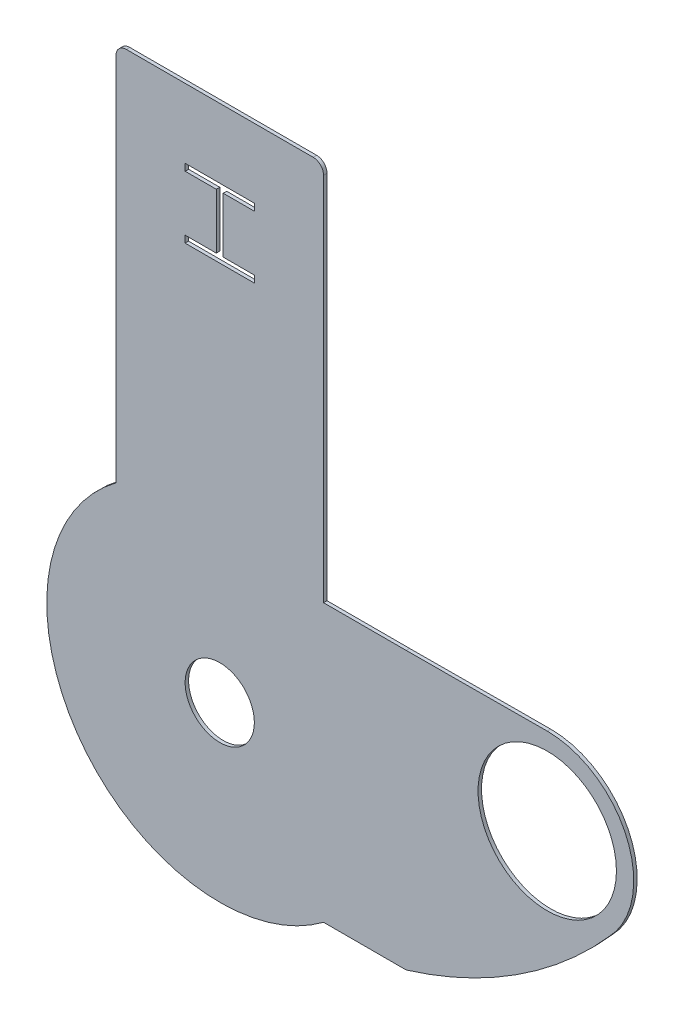
ISO-10303-21;
HEADER;
FILE_DESCRIPTION(('STEP AP214'),'2;1');
FILE_NAME('part.step','',(''),(''),'','','');
FILE_SCHEMA(('AUTOMOTIVE_DESIGN { 1 0 10303 214 1 1 1 1 }'));
ENDSEC;
DATA;
#1=APPLICATION_CONTEXT('core data for automotive mechanical design processes');
#2=APPLICATION_PROTOCOL_DEFINITION('international standard','automotive_design',2000,#1);
#3=PRODUCT_CONTEXT('',#1,'mechanical');
#4=PRODUCT('Part','Part','',(#3));
#5=PRODUCT_RELATED_PRODUCT_CATEGORY('part','',(#4));
#6=PRODUCT_DEFINITION_FORMATION('','',#4);
#7=PRODUCT_DEFINITION_CONTEXT('part definition',#1,'design');
#8=PRODUCT_DEFINITION('design','',#6,#7);
#9=PRODUCT_DEFINITION_SHAPE('','',#8);
#10=(LENGTH_UNIT() NAMED_UNIT(*) SI_UNIT(.MILLI.,.METRE.));
#11=(NAMED_UNIT(*) PLANE_ANGLE_UNIT() SI_UNIT($,.RADIAN.));
#12=(NAMED_UNIT(*) SI_UNIT($,.STERADIAN.) SOLID_ANGLE_UNIT());
#13=UNCERTAINTY_MEASURE_WITH_UNIT(LENGTH_MEASURE(1.E-05),#10,'distance_accuracy_value','');
#14=(GEOMETRIC_REPRESENTATION_CONTEXT(3) GLOBAL_UNCERTAINTY_ASSIGNED_CONTEXT((#13)) GLOBAL_UNIT_ASSIGNED_CONTEXT((#10,
#11,#12)) REPRESENTATION_CONTEXT('',''));
#15=CARTESIAN_POINT('',(0.,0.,0.));
#16=DIRECTION('',(0.,0.,1.));
#17=DIRECTION('',(1.,0.,0.));
#18=AXIS2_PLACEMENT_3D('',#15,#16,#17);
#19=CARTESIAN_POINT('',(16.4178623060247,82.7458876496733,1.));
#20=DIRECTION('',(0.,0.,-1.));
#21=DIRECTION('',(-1.,0.,0.));
#22=AXIS2_PLACEMENT_3D('',#19,#20,#21);
#23=CYLINDRICAL_SURFACE('',#22,128.336819899378);
#24=CARTESIAN_POINT('',(16.4178623060247,82.7458876496733,0.));
#25=DIRECTION('',(0.,0.,1.));
#26=DIRECTION('',(1.,0.,0.));
#27=AXIS2_PLACEMENT_3D('',#24,#25,#26);
#28=CIRCLE('',#27,128.336819899378);
#29=CARTESIAN_POINT('',(112.59410748364,-2.22745643787424,0.));
#30=VERTEX_POINT('',#29);
#31=CARTESIAN_POINT('',(53.885,-40.,0.));
#32=VERTEX_POINT('',#31);
#33=EDGE_CURVE('E355',#30,#32,#28,.F.);
#34=ORIENTED_EDGE('',*,*,#33,.F.);
#35=DIRECTION('',(0.,0.,-1.));
#36=VECTOR('',#35,1.);
#37=CARTESIAN_POINT('',(112.59410748364,-2.22745643787424,1.));
#38=LINE('',#37,#36);
#39=CARTESIAN_POINT('',(112.59410748364,-2.22745643787424,1.));
#40=VERTEX_POINT('',#39);
#41=EDGE_CURVE('E11',#40,#30,#38,.T.);
#42=ORIENTED_EDGE('',*,*,#41,.F.);
#43=CARTESIAN_POINT('',(16.4178623060247,82.7458876496733,1.));
#44=DIRECTION('',(0.,0.,1.));
#45=DIRECTION('',(1.,0.,0.));
#46=AXIS2_PLACEMENT_3D('',#43,#44,#45);
#47=CIRCLE('',#46,128.336819899378);
#48=CARTESIAN_POINT('',(53.885,-40.,1.));
#49=VERTEX_POINT('',#48);
#50=EDGE_CURVE('E358',#40,#49,#47,.F.);
#51=ORIENTED_EDGE('',*,*,#50,.T.);
#52=DIRECTION('',(0.,0.,-1.));
#53=VECTOR('',#52,1.);
#54=CARTESIAN_POINT('',(53.885,-40.,1.));
#55=LINE('',#54,#53);
#56=EDGE_CURVE('E372',#49,#32,#55,.T.);
#57=ORIENTED_EDGE('',*,*,#56,.T.);
#58=EDGE_LOOP('',(#34,#42,#51,#57));
#59=FACE_BOUND('',#58,.T.);
#60=ADVANCED_FACE('F37',(#59),#23,.T.);
#61=CARTESIAN_POINT('',(94.66,15.19,1.));
#62=DIRECTION('',(0.,0.,-1.));
#63=DIRECTION('',(-1.,0.,0.));
#64=AXIS2_PLACEMENT_3D('',#61,#62,#63);
#65=CYLINDRICAL_SURFACE('',#64,25.);
#66=CARTESIAN_POINT('',(94.66,15.19,0.));
#67=DIRECTION('',(0.,0.,1.));
#68=DIRECTION('',(1.,0.,0.));
#69=AXIS2_PLACEMENT_3D('',#66,#67,#68);
#70=CIRCLE('',#69,25.);
#71=CARTESIAN_POINT('',(94.66,40.19,0.));
#72=VERTEX_POINT('',#71);
#73=EDGE_CURVE('E375',#30,#72,#70,.T.);
#74=ORIENTED_EDGE('',*,*,#73,.T.);
#75=DIRECTION('',(0.,0.,-1.));
#76=VECTOR('',#75,1.);
#77=CARTESIAN_POINT('',(94.66,40.19,1.));
#78=LINE('',#77,#76);
#79=CARTESIAN_POINT('',(94.66,40.19,1.));
#80=VERTEX_POINT('',#79);
#81=EDGE_CURVE('E44',#80,#72,#78,.T.);
#82=ORIENTED_EDGE('',*,*,#81,.F.);
#83=CARTESIAN_POINT('',(94.66,15.19,1.));
#84=DIRECTION('',(0.,0.,1.));
#85=DIRECTION('',(1.,0.,0.));
#86=AXIS2_PLACEMENT_3D('',#83,#84,#85);
#87=CIRCLE('',#86,25.);
#88=EDGE_CURVE('E361',#40,#80,#87,.T.);
#89=ORIENTED_EDGE('',*,*,#88,.F.);
#90=ORIENTED_EDGE('',*,*,#41,.T.);
#91=EDGE_LOOP('',(#74,#82,#89,#90));
#92=FACE_BOUND('',#91,.T.);
#93=ADVANCED_FACE('F394',(#92),#65,.T.);
#94=CARTESIAN_POINT('',(-0.18521469354647,39.7480480492515,1.));
#95=DIRECTION('',(-0.00465966737710082,0.999989143691038,0.));
#96=DIRECTION('',(-0.999989143691038,-0.00465966737710082,0.));
#97=AXIS2_PLACEMENT_3D('',#94,#95,#96);
#98=PLANE('',#97);
#99=DIRECTION('',(0.999989143691038,0.00465966737710082,0.));
#100=VECTOR('',#99,1.);
#101=CARTESIAN_POINT('',(-0.18521469354647,39.7480480492515,0.));
#102=LINE('',#101,#100);
#103=CARTESIAN_POINT('',(53.885,40.,0.));
#104=VERTEX_POINT('',#103);
#105=EDGE_CURVE('E378',#104,#72,#102,.T.);
#106=ORIENTED_EDGE('',*,*,#105,.F.);
#107=DIRECTION('',(0.,0.,-1.));
#108=VECTOR('',#107,1.);
#109=CARTESIAN_POINT('',(53.885,40.,1.));
#110=LINE('',#109,#108);
#111=CARTESIAN_POINT('',(53.885,40.,1.));
#112=VERTEX_POINT('',#111);
#113=EDGE_CURVE('E385',#112,#104,#110,.T.);
#114=ORIENTED_EDGE('',*,*,#113,.F.);
#115=DIRECTION('',(0.999989143691038,0.00465966737710082,0.));
#116=VECTOR('',#115,1.);
#117=CARTESIAN_POINT('',(-0.18521469354647,39.7480480492515,1.));
#118=LINE('',#117,#116);
#119=EDGE_CURVE('E364',#112,#80,#118,.T.);
#120=ORIENTED_EDGE('',*,*,#119,.T.);
#121=ORIENTED_EDGE('',*,*,#81,.T.);
#122=EDGE_LOOP('',(#106,#114,#120,#121));
#123=FACE_BOUND('',#122,.T.);
#124=ADVANCED_FACE('F389',(#123),#98,.T.);
#125=CARTESIAN_POINT('',(0.,40.,1.));
#126=DIRECTION('',(0.,-1.,0.));
#127=DIRECTION('',(1.,0.,0.));
#128=AXIS2_PLACEMENT_3D('',#125,#126,#127);
#129=PLANE('',#128);
#130=DIRECTION('',(-1.,0.,0.));
#131=VECTOR('',#130,1.);
#132=CARTESIAN_POINT('',(0.,40.,0.));
#133=LINE('',#132,#131);
#134=CARTESIAN_POINT('',(30.,40.,0.));
#135=VERTEX_POINT('',#134);
#136=EDGE_CURVE('E56',#104,#135,#133,.T.);
#137=ORIENTED_EDGE('',*,*,#136,.T.);
#138=DIRECTION('',(0.,0.,1.));
#139=VECTOR('',#138,1.);
#140=CARTESIAN_POINT('',(30.,40.,0.));
#141=LINE('',#140,#139);
#142=CARTESIAN_POINT('',(30.,40.,1.));
#143=VERTEX_POINT('',#142);
#144=EDGE_CURVE('E51',#135,#143,#141,.T.);
#145=ORIENTED_EDGE('',*,*,#144,.T.);
#146=DIRECTION('',(-1.,0.,0.));
#147=VECTOR('',#146,1.);
#148=CARTESIAN_POINT('',(0.,40.,1.));
#149=LINE('',#148,#147);
#150=EDGE_CURVE('E367',#112,#143,#149,.T.);
#151=ORIENTED_EDGE('',*,*,#150,.F.);
#152=ORIENTED_EDGE('',*,*,#113,.T.);
#153=EDGE_LOOP('',(#137,#145,#151,#152));
#154=FACE_BOUND('',#153,.T.);
#155=ADVANCED_FACE('F407',(#154),#129,.F.);
#156=CARTESIAN_POINT('',(0.,-40.,1.));
#157=DIRECTION('',(0.,-1.,0.));
#158=DIRECTION('',(1.,0.,0.));
#159=AXIS2_PLACEMENT_3D('',#156,#157,#158);
#160=PLANE('',#159);
#161=DIRECTION('',(0.,0.,1.));
#162=VECTOR('',#161,1.);
#163=CARTESIAN_POINT('',(30.,-40.,0.));
#164=LINE('',#163,#162);
#165=CARTESIAN_POINT('',(30.,-40.,0.));
#166=VERTEX_POINT('',#165);
#167=CARTESIAN_POINT('',(30.,-40.,1.));
#168=VERTEX_POINT('',#167);
#169=EDGE_CURVE('E327',#166,#168,#164,.T.);
#170=ORIENTED_EDGE('',*,*,#169,.F.);
#171=DIRECTION('',(-1.,0.,0.));
#172=VECTOR('',#171,1.);
#173=CARTESIAN_POINT('',(0.,-40.,0.));
#174=LINE('',#173,#172);
#175=EDGE_CURVE('E362',#32,#166,#174,.T.);
#176=ORIENTED_EDGE('',*,*,#175,.F.);
#177=ORIENTED_EDGE('',*,*,#56,.F.);
#178=DIRECTION('',(-1.,0.,0.));
#179=VECTOR('',#178,1.);
#180=CARTESIAN_POINT('',(0.,-40.,1.));
#181=LINE('',#180,#179);
#182=EDGE_CURVE('E369',#49,#168,#181,.T.);
#183=ORIENTED_EDGE('',*,*,#182,.T.);
#184=EDGE_LOOP('',(#170,#176,#177,#183));
#185=FACE_BOUND('',#184,.T.);
#186=ADVANCED_FACE('F409',(#185),#160,.T.);
#187=CARTESIAN_POINT('',(0.,0.,1.));
#188=DIRECTION('',(0.,0.,1.));
#189=DIRECTION('',(1.,0.,0.));
#190=AXIS2_PLACEMENT_3D('',#187,#188,#189);
#191=PLANE('',#190);
#192=CARTESIAN_POINT('',(0.,0.,1.));
#193=DIRECTION('',(0.,0.,-1.));
#194=DIRECTION('',(1.,0.,0.));
#195=AXIS2_PLACEMENT_3D('',#192,#193,#194);
#196=CIRCLE('',#195,50.);
#197=CARTESIAN_POINT('',(-30.,40.,1.));
#198=VERTEX_POINT('',#197);
#199=EDGE_CURVE('E337',#168,#198,#196,.T.);
#200=ORIENTED_EDGE('',*,*,#199,.F.);
#201=ORIENTED_EDGE('',*,*,#182,.F.);
#202=ORIENTED_EDGE('',*,*,#50,.F.);
#203=ORIENTED_EDGE('',*,*,#88,.T.);
#204=ORIENTED_EDGE('',*,*,#119,.F.);
#205=ORIENTED_EDGE('',*,*,#150,.T.);
#206=DIRECTION('',(0.,1.,0.));
#207=VECTOR('',#206,1.);
#208=CARTESIAN_POINT('',(30.,40.,1.));
#209=LINE('',#208,#207);
#210=CARTESIAN_POINT('',(30.,147.,1.));
#211=VERTEX_POINT('',#210);
#212=EDGE_CURVE('E276',#143,#211,#209,.T.);
#213=ORIENTED_EDGE('',*,*,#212,.T.);
#214=CARTESIAN_POINT('',(27.,147.,1.));
#215=DIRECTION('',(0.,0.,1.));
#216=DIRECTION('',(1.,0.,0.));
#217=AXIS2_PLACEMENT_3D('',#214,#215,#216);
#218=CIRCLE('',#217,3.);
#219=CARTESIAN_POINT('',(27.,150.,1.));
#220=VERTEX_POINT('',#219);
#221=EDGE_CURVE('E314',#211,#220,#218,.T.);
#222=ORIENTED_EDGE('',*,*,#221,.T.);
#223=DIRECTION('',(-1.,0.,0.));
#224=VECTOR('',#223,1.);
#225=CARTESIAN_POINT('',(-27.,150.,1.));
#226=LINE('',#225,#224);
#227=CARTESIAN_POINT('',(-27.,150.,1.));
#228=VERTEX_POINT('',#227);
#229=EDGE_CURVE('E317',#220,#228,#226,.T.);
#230=ORIENTED_EDGE('',*,*,#229,.T.);
#231=CARTESIAN_POINT('',(-27.,147.,1.));
#232=DIRECTION('',(0.,0.,1.));
#233=DIRECTION('',(-1.,0.,0.));
#234=AXIS2_PLACEMENT_3D('',#231,#232,#233);
#235=CIRCLE('',#234,3.);
#236=CARTESIAN_POINT('',(-30.,147.,1.));
#237=VERTEX_POINT('',#236);
#238=EDGE_CURVE('E320',#228,#237,#235,.T.);
#239=ORIENTED_EDGE('',*,*,#238,.T.);
#240=DIRECTION('',(0.,-1.,0.));
#241=VECTOR('',#240,1.);
#242=CARTESIAN_POINT('',(-30.,40.,1.));
#243=LINE('',#242,#241);
#244=EDGE_CURVE('E300',#237,#198,#243,.T.);
#245=ORIENTED_EDGE('',*,*,#244,.T.);
#246=EDGE_LOOP('',(#200,#201,#202,#203,#204,#205,#213,#222,#230,#239,#245));
#247=FACE_BOUND('',#246,.T.);
#248=CARTESIAN_POINT('',(94.66,15.19,1.));
#249=DIRECTION('',(0.,0.,1.));
#250=DIRECTION('',(1.,0.,0.));
#251=AXIS2_PLACEMENT_3D('',#248,#249,#250);
#252=CIRCLE('',#251,20.);
#253=CARTESIAN_POINT('',(114.66,15.19,1.));
#254=VERTEX_POINT('',#253);
#255=EDGE_CURVE('E345',#254,#254,#252,.T.);
#256=ORIENTED_EDGE('',*,*,#255,.F.);
#257=EDGE_LOOP('',(#256));
#258=FACE_BOUND('',#257,.T.);
#259=CARTESIAN_POINT('',(0.,0.,1.));
#260=DIRECTION('',(0.,0.,1.));
#261=DIRECTION('',(1.,0.,0.));
#262=AXIS2_PLACEMENT_3D('',#259,#260,#261);
#263=CIRCLE('',#262,10.);
#264=CARTESIAN_POINT('',(10.,0.,1.));
#265=VERTEX_POINT('',#264);
#266=EDGE_CURVE('E349',#265,#265,#263,.T.);
#267=ORIENTED_EDGE('',*,*,#266,.F.);
#268=EDGE_LOOP('',(#267));
#269=FACE_BOUND('',#268,.T.);
#270=DIRECTION('',(0.,1.,0.));
#271=VECTOR('',#270,1.);
#272=CARTESIAN_POINT('',(10.,112.,1.));
#273=LINE('',#272,#271);
#274=CARTESIAN_POINT('',(10.,110.,1.));
#275=VERTEX_POINT('',#274);
#276=CARTESIAN_POINT('',(10.,112.,1.));
#277=VERTEX_POINT('',#276);
#278=EDGE_CURVE('E196',#275,#277,#273,.T.);
#279=ORIENTED_EDGE('',*,*,#278,.F.);
#280=DIRECTION('',(1.,0.,0.));
#281=VECTOR('',#280,1.);
#282=CARTESIAN_POINT('',(-10.,110.,1.));
#283=LINE('',#282,#281);
#284=CARTESIAN_POINT('',(-10.,110.,1.));
#285=VERTEX_POINT('',#284);
#286=EDGE_CURVE('E214',#285,#275,#283,.T.);
#287=ORIENTED_EDGE('',*,*,#286,.F.);
#288=DIRECTION('',(0.,-1.,0.));
#289=VECTOR('',#288,1.);
#290=CARTESIAN_POINT('',(-10.,112.,1.));
#291=LINE('',#290,#289);
#292=CARTESIAN_POINT('',(-10.,112.,1.));
#293=VERTEX_POINT('',#292);
#294=EDGE_CURVE('E217',#293,#285,#291,.T.);
#295=ORIENTED_EDGE('',*,*,#294,.F.);
#296=DIRECTION('',(-1.,0.,0.));
#297=VECTOR('',#296,1.);
#298=CARTESIAN_POINT('',(-0.999999999999999,112.,1.));
#299=LINE('',#298,#297);
#300=CARTESIAN_POINT('',(-0.999999999999999,112.,1.));
#301=VERTEX_POINT('',#300);
#302=EDGE_CURVE('E269',#301,#293,#299,.T.);
#303=ORIENTED_EDGE('',*,*,#302,.F.);
#304=DIRECTION('',(0.,-1.,0.));
#305=VECTOR('',#304,1.);
#306=CARTESIAN_POINT('',(-0.999999999999999,128.,1.));
#307=LINE('',#306,#305);
#308=CARTESIAN_POINT('',(-0.999999999999999,128.,1.));
#309=VERTEX_POINT('',#308);
#310=EDGE_CURVE('E266',#309,#301,#307,.T.);
#311=ORIENTED_EDGE('',*,*,#310,.F.);
#312=DIRECTION('',(1.,0.,0.));
#313=VECTOR('',#312,1.);
#314=CARTESIAN_POINT('',(-0.999999999999999,128.,1.));
#315=LINE('',#314,#313);
#316=CARTESIAN_POINT('',(-10.,128.,1.));
#317=VERTEX_POINT('',#316);
#318=EDGE_CURVE('E263',#317,#309,#315,.T.);
#319=ORIENTED_EDGE('',*,*,#318,.F.);
#320=DIRECTION('',(0.,-1.,0.));
#321=VECTOR('',#320,1.);
#322=CARTESIAN_POINT('',(-10.,128.,1.));
#323=LINE('',#322,#321);
#324=CARTESIAN_POINT('',(-10.,130.,1.));
#325=VERTEX_POINT('',#324);
#326=EDGE_CURVE('E260',#325,#317,#323,.T.);
#327=ORIENTED_EDGE('',*,*,#326,.F.);
#328=DIRECTION('',(-1.,0.,0.));
#329=VECTOR('',#328,1.);
#330=CARTESIAN_POINT('',(-10.,130.,1.));
#331=LINE('',#330,#329);
#332=CARTESIAN_POINT('',(10.,130.,1.));
#333=VERTEX_POINT('',#332);
#334=EDGE_CURVE('E257',#333,#325,#331,.T.);
#335=ORIENTED_EDGE('',*,*,#334,.F.);
#336=DIRECTION('',(0.,1.,0.));
#337=VECTOR('',#336,1.);
#338=CARTESIAN_POINT('',(10.,128.,1.));
#339=LINE('',#338,#337);
#340=CARTESIAN_POINT('',(10.,128.,1.));
#341=VERTEX_POINT('',#340);
#342=EDGE_CURVE('E254',#341,#333,#339,.T.);
#343=ORIENTED_EDGE('',*,*,#342,.F.);
#344=DIRECTION('',(1.,0.,0.));
#345=VECTOR('',#344,1.);
#346=CARTESIAN_POINT('',(0.999999999999999,128.,1.));
#347=LINE('',#346,#345);
#348=CARTESIAN_POINT('',(0.999999999999999,128.,1.));
#349=VERTEX_POINT('',#348);
#350=EDGE_CURVE('E251',#349,#341,#347,.T.);
#351=ORIENTED_EDGE('',*,*,#350,.F.);
#352=DIRECTION('',(0.,1.,0.));
#353=VECTOR('',#352,1.);
#354=CARTESIAN_POINT('',(0.999999999999999,128.,1.));
#355=LINE('',#354,#353);
#356=CARTESIAN_POINT('',(0.999999999999999,112.,1.));
#357=VERTEX_POINT('',#356);
#358=EDGE_CURVE('E248',#357,#349,#355,.T.);
#359=ORIENTED_EDGE('',*,*,#358,.F.);
#360=DIRECTION('',(-1.,0.,0.));
#361=VECTOR('',#360,1.);
#362=CARTESIAN_POINT('',(0.999999999999999,112.,1.));
#363=LINE('',#362,#361);
#364=EDGE_CURVE('E246',#277,#357,#363,.T.);
#365=ORIENTED_EDGE('',*,*,#364,.F.);
#366=EDGE_LOOP('',(#279,#287,#295,#303,#311,#319,#327,#335,#343,#351,#359,#365));
#367=FACE_BOUND('',#366,.T.);
#368=ADVANCED_FACE('F405',(#247,#258,#269,#367),#191,.T.);
#369=CARTESIAN_POINT('',(0.,0.,0.));
#370=DIRECTION('',(0.,0.,1.));
#371=DIRECTION('',(1.,0.,0.));
#372=AXIS2_PLACEMENT_3D('',#369,#370,#371);
#373=PLANE('',#372);
#374=CARTESIAN_POINT('',(94.66,15.19,0.));
#375=DIRECTION('',(0.,0.,1.));
#376=DIRECTION('',(1.,0.,0.));
#377=AXIS2_PLACEMENT_3D('',#374,#375,#376);
#378=CIRCLE('',#377,20.);
#379=CARTESIAN_POINT('',(114.66,15.19,0.));
#380=VERTEX_POINT('',#379);
#381=EDGE_CURVE('E346',#380,#380,#378,.T.);
#382=ORIENTED_EDGE('',*,*,#381,.T.);
#383=EDGE_LOOP('',(#382));
#384=FACE_BOUND('',#383,.T.);
#385=CARTESIAN_POINT('',(0.,0.,0.));
#386=DIRECTION('',(0.,0.,1.));
#387=DIRECTION('',(1.,0.,0.));
#388=AXIS2_PLACEMENT_3D('',#385,#386,#387);
#389=CIRCLE('',#388,10.);
#390=CARTESIAN_POINT('',(10.,0.,0.));
#391=VERTEX_POINT('',#390);
#392=EDGE_CURVE('E352',#391,#391,#389,.T.);
#393=ORIENTED_EDGE('',*,*,#392,.T.);
#394=EDGE_LOOP('',(#393));
#395=FACE_BOUND('',#394,.T.);
#396=ORIENTED_EDGE('',*,*,#175,.T.);
#397=CARTESIAN_POINT('',(0.,0.,0.));
#398=DIRECTION('',(0.,0.,-1.));
#399=DIRECTION('',(1.,0.,0.));
#400=AXIS2_PLACEMENT_3D('',#397,#398,#399);
#401=CIRCLE('',#400,50.);
#402=CARTESIAN_POINT('',(-30.,40.,0.));
#403=VERTEX_POINT('',#402);
#404=EDGE_CURVE('E338',#166,#403,#401,.T.);
#405=ORIENTED_EDGE('',*,*,#404,.T.);
#406=DIRECTION('',(0.,-1.,0.));
#407=VECTOR('',#406,1.);
#408=CARTESIAN_POINT('',(-30.,40.,0.));
#409=LINE('',#408,#407);
#410=CARTESIAN_POINT('',(-30.,147.,0.));
#411=VERTEX_POINT('',#410);
#412=EDGE_CURVE('E309',#411,#403,#409,.T.);
#413=ORIENTED_EDGE('',*,*,#412,.F.);
#414=CARTESIAN_POINT('',(-27.,147.,0.));
#415=DIRECTION('',(0.,0.,1.));
#416=DIRECTION('',(-1.,0.,0.));
#417=AXIS2_PLACEMENT_3D('',#414,#415,#416);
#418=CIRCLE('',#417,3.);
#419=CARTESIAN_POINT('',(-27.,150.,0.));
#420=VERTEX_POINT('',#419);
#421=EDGE_CURVE('E306',#420,#411,#418,.T.);
#422=ORIENTED_EDGE('',*,*,#421,.F.);
#423=DIRECTION('',(-1.,0.,0.));
#424=VECTOR('',#423,1.);
#425=CARTESIAN_POINT('',(-27.,150.,0.));
#426=LINE('',#425,#424);
#427=CARTESIAN_POINT('',(27.,150.,0.));
#428=VERTEX_POINT('',#427);
#429=EDGE_CURVE('E303',#428,#420,#426,.T.);
#430=ORIENTED_EDGE('',*,*,#429,.F.);
#431=CARTESIAN_POINT('',(27.,147.,0.));
#432=DIRECTION('',(0.,0.,1.));
#433=DIRECTION('',(1.,0.,0.));
#434=AXIS2_PLACEMENT_3D('',#431,#432,#433);
#435=CIRCLE('',#434,3.);
#436=CARTESIAN_POINT('',(30.,147.,0.));
#437=VERTEX_POINT('',#436);
#438=EDGE_CURVE('E299',#437,#428,#435,.T.);
#439=ORIENTED_EDGE('',*,*,#438,.F.);
#440=DIRECTION('',(0.,1.,0.));
#441=VECTOR('',#440,1.);
#442=CARTESIAN_POINT('',(30.,40.,0.));
#443=LINE('',#442,#441);
#444=EDGE_CURVE('E296',#135,#437,#443,.T.);
#445=ORIENTED_EDGE('',*,*,#444,.F.);
#446=ORIENTED_EDGE('',*,*,#136,.F.);
#447=ORIENTED_EDGE('',*,*,#105,.T.);
#448=ORIENTED_EDGE('',*,*,#73,.F.);
#449=ORIENTED_EDGE('',*,*,#33,.T.);
#450=EDGE_LOOP('',(#396,#405,#413,#422,#430,#439,#445,#446,#447,#448,#449));
#451=FACE_BOUND('',#450,.T.);
#452=DIRECTION('',(1.,0.,0.));
#453=VECTOR('',#452,1.);
#454=CARTESIAN_POINT('',(-10.,110.,0.));
#455=LINE('',#454,#453);
#456=CARTESIAN_POINT('',(-10.,110.,0.));
#457=VERTEX_POINT('',#456);
#458=CARTESIAN_POINT('',(10.,110.,0.));
#459=VERTEX_POINT('',#458);
#460=EDGE_CURVE('E201',#457,#459,#455,.T.);
#461=ORIENTED_EDGE('',*,*,#460,.T.);
#462=DIRECTION('',(0.,1.,0.));
#463=VECTOR('',#462,1.);
#464=CARTESIAN_POINT('',(10.,112.,0.));
#465=LINE('',#464,#463);
#466=CARTESIAN_POINT('',(10.,112.,0.));
#467=VERTEX_POINT('',#466);
#468=EDGE_CURVE('E193',#459,#467,#465,.T.);
#469=ORIENTED_EDGE('',*,*,#468,.T.);
#470=DIRECTION('',(-1.,0.,0.));
#471=VECTOR('',#470,1.);
#472=CARTESIAN_POINT('',(0.999999999999999,112.,0.));
#473=LINE('',#472,#471);
#474=CARTESIAN_POINT('',(1.,112.,0.));
#475=VERTEX_POINT('',#474);
#476=EDGE_CURVE('E205',#467,#475,#473,.T.);
#477=ORIENTED_EDGE('',*,*,#476,.T.);
#478=DIRECTION('',(0.,1.,0.));
#479=VECTOR('',#478,1.);
#480=CARTESIAN_POINT('',(0.999999999999999,128.,0.));
#481=LINE('',#480,#479);
#482=CARTESIAN_POINT('',(0.999999999999999,128.,0.));
#483=VERTEX_POINT('',#482);
#484=EDGE_CURVE('E209',#475,#483,#481,.T.);
#485=ORIENTED_EDGE('',*,*,#484,.T.);
#486=DIRECTION('',(1.,0.,0.));
#487=VECTOR('',#486,1.);
#488=CARTESIAN_POINT('',(0.999999999999999,128.,0.));
#489=LINE('',#488,#487);
#490=CARTESIAN_POINT('',(10.,128.,0.));
#491=VERTEX_POINT('',#490);
#492=EDGE_CURVE('E221',#483,#491,#489,.T.);
#493=ORIENTED_EDGE('',*,*,#492,.T.);
#494=DIRECTION('',(0.,1.,0.));
#495=VECTOR('',#494,1.);
#496=CARTESIAN_POINT('',(10.,128.,0.));
#497=LINE('',#496,#495);
#498=CARTESIAN_POINT('',(10.,130.,0.));
#499=VERTEX_POINT('',#498);
#500=EDGE_CURVE('E224',#491,#499,#497,.T.);
#501=ORIENTED_EDGE('',*,*,#500,.T.);
#502=DIRECTION('',(-1.,0.,0.));
#503=VECTOR('',#502,1.);
#504=CARTESIAN_POINT('',(-10.,130.,0.));
#505=LINE('',#504,#503);
#506=CARTESIAN_POINT('',(-10.,130.,0.));
#507=VERTEX_POINT('',#506);
#508=EDGE_CURVE('E227',#499,#507,#505,.T.);
#509=ORIENTED_EDGE('',*,*,#508,.T.);
#510=DIRECTION('',(0.,-1.,0.));
#511=VECTOR('',#510,1.);
#512=CARTESIAN_POINT('',(-10.,128.,0.));
#513=LINE('',#512,#511);
#514=CARTESIAN_POINT('',(-10.,128.,0.));
#515=VERTEX_POINT('',#514);
#516=EDGE_CURVE('E230',#507,#515,#513,.T.);
#517=ORIENTED_EDGE('',*,*,#516,.T.);
#518=DIRECTION('',(1.,0.,0.));
#519=VECTOR('',#518,1.);
#520=CARTESIAN_POINT('',(-0.999999999999999,128.,0.));
#521=LINE('',#520,#519);
#522=CARTESIAN_POINT('',(-0.999999999999999,128.,0.));
#523=VERTEX_POINT('',#522);
#524=EDGE_CURVE('E233',#515,#523,#521,.T.);
#525=ORIENTED_EDGE('',*,*,#524,.T.);
#526=DIRECTION('',(0.,-1.,0.));
#527=VECTOR('',#526,1.);
#528=CARTESIAN_POINT('',(-0.999999999999999,128.,0.));
#529=LINE('',#528,#527);
#530=CARTESIAN_POINT('',(-0.999999999999999,112.,0.));
#531=VERTEX_POINT('',#530);
#532=EDGE_CURVE('E236',#523,#531,#529,.T.);
#533=ORIENTED_EDGE('',*,*,#532,.T.);
#534=DIRECTION('',(-1.,0.,0.));
#535=VECTOR('',#534,1.);
#536=CARTESIAN_POINT('',(-0.999999999999999,112.,0.));
#537=LINE('',#536,#535);
#538=CARTESIAN_POINT('',(-10.,112.,0.));
#539=VERTEX_POINT('',#538);
#540=EDGE_CURVE('E239',#531,#539,#537,.T.);
#541=ORIENTED_EDGE('',*,*,#540,.T.);
#542=DIRECTION('',(0.,-1.,0.));
#543=VECTOR('',#542,1.);
#544=CARTESIAN_POINT('',(-10.,112.,0.));
#545=LINE('',#544,#543);
#546=EDGE_CURVE('E242',#539,#457,#545,.T.);
#547=ORIENTED_EDGE('',*,*,#546,.T.);
#548=EDGE_LOOP('',(#461,#469,#477,#485,#493,#501,#509,#517,#525,#533,#541,#547));
#549=FACE_BOUND('',#548,.T.);
#550=ADVANCED_FACE('F211',(#384,#395,#451,#549),#373,.F.);
#551=CARTESIAN_POINT('',(0.,0.,0.));
#552=DIRECTION('',(0.,0.,1.));
#553=DIRECTION('',(1.,0.,0.));
#554=AXIS2_PLACEMENT_3D('',#551,#552,#553);
#555=CYLINDRICAL_SURFACE('',#554,10.);
#556=ORIENTED_EDGE('',*,*,#392,.F.);
#557=EDGE_LOOP('',(#556));
#558=FACE_BOUND('',#557,.T.);
#559=ORIENTED_EDGE('',*,*,#266,.T.);
#560=EDGE_LOOP('',(#559));
#561=FACE_BOUND('',#560,.T.);
#562=ADVANCED_FACE('F457',(#558,#561),#555,.F.);
#563=CARTESIAN_POINT('',(94.66,15.19,0.));
#564=DIRECTION('',(0.,0.,1.));
#565=DIRECTION('',(1.,0.,0.));
#566=AXIS2_PLACEMENT_3D('',#563,#564,#565);
#567=CYLINDRICAL_SURFACE('',#566,20.);
#568=ORIENTED_EDGE('',*,*,#381,.F.);
#569=EDGE_LOOP('',(#568));
#570=FACE_BOUND('',#569,.T.);
#571=ORIENTED_EDGE('',*,*,#255,.T.);
#572=EDGE_LOOP('',(#571));
#573=FACE_BOUND('',#572,.T.);
#574=ADVANCED_FACE('F454',(#570,#573),#567,.F.);
#575=CARTESIAN_POINT('',(0.,0.,0.));
#576=DIRECTION('',(0.,0.,1.));
#577=DIRECTION('',(1.,0.,0.));
#578=AXIS2_PLACEMENT_3D('',#575,#576,#577);
#579=CYLINDRICAL_SURFACE('',#578,50.);
#580=ORIENTED_EDGE('',*,*,#199,.T.);
#581=DIRECTION('',(0.,0.,1.));
#582=VECTOR('',#581,1.);
#583=CARTESIAN_POINT('',(-30.,40.,0.));
#584=LINE('',#583,#582);
#585=EDGE_CURVE('E341',#403,#198,#584,.T.);
#586=ORIENTED_EDGE('',*,*,#585,.F.);
#587=ORIENTED_EDGE('',*,*,#404,.F.);
#588=ORIENTED_EDGE('',*,*,#169,.T.);
#589=EDGE_LOOP('',(#580,#586,#587,#588));
#590=FACE_BOUND('',#589,.T.);
#591=ADVANCED_FACE('F428',(#590),#579,.T.);
#592=CARTESIAN_POINT('',(-30.,40.,0.));
#593=DIRECTION('',(-1.,0.,0.));
#594=DIRECTION('',(0.,0.,1.));
#595=AXIS2_PLACEMENT_3D('',#592,#593,#594);
#596=PLANE('',#595);
#597=ORIENTED_EDGE('',*,*,#244,.F.);
#598=DIRECTION('',(0.,0.,1.));
#599=VECTOR('',#598,1.);
#600=CARTESIAN_POINT('',(-30.,147.,0.));
#601=LINE('',#600,#599);
#602=EDGE_CURVE('E325',#411,#237,#601,.T.);
#603=ORIENTED_EDGE('',*,*,#602,.F.);
#604=ORIENTED_EDGE('',*,*,#412,.T.);
#605=ORIENTED_EDGE('',*,*,#585,.T.);
#606=EDGE_LOOP('',(#597,#603,#604,#605));
#607=FACE_BOUND('',#606,.T.);
#608=ADVANCED_FACE('F433',(#607),#596,.T.);
#609=CARTESIAN_POINT('',(-27.,147.,0.));
#610=DIRECTION('',(0.,0.,1.));
#611=DIRECTION('',(1.,0.,0.));
#612=AXIS2_PLACEMENT_3D('',#609,#610,#611);
#613=CYLINDRICAL_SURFACE('',#612,3.);
#614=ORIENTED_EDGE('',*,*,#238,.F.);
#615=DIRECTION('',(0.,0.,1.));
#616=VECTOR('',#615,1.);
#617=CARTESIAN_POINT('',(-27.,150.,0.));
#618=LINE('',#617,#616);
#619=EDGE_CURVE('E328',#420,#228,#618,.T.);
#620=ORIENTED_EDGE('',*,*,#619,.F.);
#621=ORIENTED_EDGE('',*,*,#421,.T.);
#622=ORIENTED_EDGE('',*,*,#602,.T.);
#623=EDGE_LOOP('',(#614,#620,#621,#622));
#624=FACE_BOUND('',#623,.T.);
#625=ADVANCED_FACE('F436',(#624),#613,.T.);
#626=CARTESIAN_POINT('',(-27.,150.,0.));
#627=DIRECTION('',(0.,1.,0.));
#628=DIRECTION('',(0.,0.,1.));
#629=AXIS2_PLACEMENT_3D('',#626,#627,#628);
#630=PLANE('',#629);
#631=ORIENTED_EDGE('',*,*,#229,.F.);
#632=DIRECTION('',(0.,0.,1.));
#633=VECTOR('',#632,1.);
#634=CARTESIAN_POINT('',(27.,150.,0.));
#635=LINE('',#634,#633);
#636=EDGE_CURVE('E330',#428,#220,#635,.T.);
#637=ORIENTED_EDGE('',*,*,#636,.F.);
#638=ORIENTED_EDGE('',*,*,#429,.T.);
#639=ORIENTED_EDGE('',*,*,#619,.T.);
#640=EDGE_LOOP('',(#631,#637,#638,#639));
#641=FACE_BOUND('',#640,.T.);
#642=ADVANCED_FACE('F439',(#641),#630,.T.);
#643=CARTESIAN_POINT('',(27.,147.,0.));
#644=DIRECTION('',(0.,0.,1.));
#645=DIRECTION('',(1.,0.,0.));
#646=AXIS2_PLACEMENT_3D('',#643,#644,#645);
#647=CYLINDRICAL_SURFACE('',#646,3.);
#648=ORIENTED_EDGE('',*,*,#221,.F.);
#649=DIRECTION('',(0.,0.,1.));
#650=VECTOR('',#649,1.);
#651=CARTESIAN_POINT('',(30.,147.,0.));
#652=LINE('',#651,#650);
#653=EDGE_CURVE('E332',#437,#211,#652,.T.);
#654=ORIENTED_EDGE('',*,*,#653,.F.);
#655=ORIENTED_EDGE('',*,*,#438,.T.);
#656=ORIENTED_EDGE('',*,*,#636,.T.);
#657=EDGE_LOOP('',(#648,#654,#655,#656));
#658=FACE_BOUND('',#657,.T.);
#659=ADVANCED_FACE('F441',(#658),#647,.T.);
#660=CARTESIAN_POINT('',(30.,40.,0.));
#661=DIRECTION('',(1.,0.,0.));
#662=DIRECTION('',(0.,0.,-1.));
#663=AXIS2_PLACEMENT_3D('',#660,#661,#662);
#664=PLANE('',#663);
#665=ORIENTED_EDGE('',*,*,#212,.F.);
#666=ORIENTED_EDGE('',*,*,#144,.F.);
#667=ORIENTED_EDGE('',*,*,#444,.T.);
#668=ORIENTED_EDGE('',*,*,#653,.T.);
#669=EDGE_LOOP('',(#665,#666,#667,#668));
#670=FACE_BOUND('',#669,.T.);
#671=ADVANCED_FACE('F402',(#670),#664,.T.);
#672=CARTESIAN_POINT('',(10.,112.,0.));
#673=DIRECTION('',(1.,0.,0.));
#674=DIRECTION('',(0.,0.,-1.));
#675=AXIS2_PLACEMENT_3D('',#672,#673,#674);
#676=PLANE('',#675);
#677=ORIENTED_EDGE('',*,*,#278,.T.);
#678=DIRECTION('',(0.,0.,1.));
#679=VECTOR('',#678,1.);
#680=CARTESIAN_POINT('',(10.,112.,0.));
#681=LINE('',#680,#679);
#682=EDGE_CURVE('E189',#467,#277,#681,.T.);
#683=ORIENTED_EDGE('',*,*,#682,.F.);
#684=ORIENTED_EDGE('',*,*,#468,.F.);
#685=DIRECTION('',(0.,0.,1.));
#686=VECTOR('',#685,1.);
#687=CARTESIAN_POINT('',(10.,110.,0.));
#688=LINE('',#687,#686);
#689=EDGE_CURVE('E274',#459,#275,#688,.T.);
#690=ORIENTED_EDGE('',*,*,#689,.T.);
#691=EDGE_LOOP('',(#677,#683,#684,#690));
#692=FACE_BOUND('',#691,.T.);
#693=ADVANCED_FACE('F191',(#692),#676,.F.);
#694=CARTESIAN_POINT('',(-10.,110.,0.));
#695=DIRECTION('',(0.,-1.,0.));
#696=DIRECTION('',(0.,0.,-1.));
#697=AXIS2_PLACEMENT_3D('',#694,#695,#696);
#698=PLANE('',#697);
#699=ORIENTED_EDGE('',*,*,#286,.T.);
#700=ORIENTED_EDGE('',*,*,#689,.F.);
#701=ORIENTED_EDGE('',*,*,#460,.F.);
#702=DIRECTION('',(0.,0.,1.));
#703=VECTOR('',#702,1.);
#704=CARTESIAN_POINT('',(-10.,110.,0.));
#705=LINE('',#704,#703);
#706=EDGE_CURVE('E277',#457,#285,#705,.T.);
#707=ORIENTED_EDGE('',*,*,#706,.T.);
#708=EDGE_LOOP('',(#699,#700,#701,#707));
#709=FACE_BOUND('',#708,.T.);
#710=ADVANCED_FACE('F512',(#709),#698,.F.);
#711=CARTESIAN_POINT('',(-10.,112.,0.));
#712=DIRECTION('',(-1.,0.,0.));
#713=DIRECTION('',(0.,0.,1.));
#714=AXIS2_PLACEMENT_3D('',#711,#712,#713);
#715=PLANE('',#714);
#716=ORIENTED_EDGE('',*,*,#294,.T.);
#717=ORIENTED_EDGE('',*,*,#706,.F.);
#718=ORIENTED_EDGE('',*,*,#546,.F.);
#719=DIRECTION('',(0.,0.,1.));
#720=VECTOR('',#719,1.);
#721=CARTESIAN_POINT('',(-10.,112.,0.));
#722=LINE('',#721,#720);
#723=EDGE_CURVE('E279',#539,#293,#722,.T.);
#724=ORIENTED_EDGE('',*,*,#723,.T.);
#725=EDGE_LOOP('',(#716,#717,#718,#724));
#726=FACE_BOUND('',#725,.T.);
#727=ADVANCED_FACE('F510',(#726),#715,.F.);
#728=CARTESIAN_POINT('',(-0.999999999999999,112.,0.));
#729=DIRECTION('',(0.,1.,0.));
#730=DIRECTION('',(0.,0.,1.));
#731=AXIS2_PLACEMENT_3D('',#728,#729,#730);
#732=PLANE('',#731);
#733=ORIENTED_EDGE('',*,*,#302,.T.);
#734=ORIENTED_EDGE('',*,*,#723,.F.);
#735=ORIENTED_EDGE('',*,*,#540,.F.);
#736=DIRECTION('',(0.,0.,1.));
#737=VECTOR('',#736,1.);
#738=CARTESIAN_POINT('',(-0.999999999999999,112.,0.));
#739=LINE('',#738,#737);
#740=EDGE_CURVE('E281',#531,#301,#739,.T.);
#741=ORIENTED_EDGE('',*,*,#740,.T.);
#742=EDGE_LOOP('',(#733,#734,#735,#741));
#743=FACE_BOUND('',#742,.T.);
#744=ADVANCED_FACE('F507',(#743),#732,.F.);
#745=CARTESIAN_POINT('',(-0.999999999999999,128.,0.));
#746=DIRECTION('',(-1.,0.,0.));
#747=DIRECTION('',(0.,0.,1.));
#748=AXIS2_PLACEMENT_3D('',#745,#746,#747);
#749=PLANE('',#748);
#750=ORIENTED_EDGE('',*,*,#310,.T.);
#751=ORIENTED_EDGE('',*,*,#740,.F.);
#752=ORIENTED_EDGE('',*,*,#532,.F.);
#753=DIRECTION('',(0.,0.,1.));
#754=VECTOR('',#753,1.);
#755=CARTESIAN_POINT('',(-0.999999999999999,128.,0.));
#756=LINE('',#755,#754);
#757=EDGE_CURVE('E283',#523,#309,#756,.T.);
#758=ORIENTED_EDGE('',*,*,#757,.T.);
#759=EDGE_LOOP('',(#750,#751,#752,#758));
#760=FACE_BOUND('',#759,.T.);
#761=ADVANCED_FACE('F503',(#760),#749,.F.);
#762=CARTESIAN_POINT('',(-0.999999999999999,128.,0.));
#763=DIRECTION('',(0.,-1.,0.));
#764=DIRECTION('',(0.,0.,-1.));
#765=AXIS2_PLACEMENT_3D('',#762,#763,#764);
#766=PLANE('',#765);
#767=ORIENTED_EDGE('',*,*,#318,.T.);
#768=ORIENTED_EDGE('',*,*,#757,.F.);
#769=ORIENTED_EDGE('',*,*,#524,.F.);
#770=DIRECTION('',(0.,0.,1.));
#771=VECTOR('',#770,1.);
#772=CARTESIAN_POINT('',(-10.,128.,0.));
#773=LINE('',#772,#771);
#774=EDGE_CURVE('E285',#515,#317,#773,.T.);
#775=ORIENTED_EDGE('',*,*,#774,.T.);
#776=EDGE_LOOP('',(#767,#768,#769,#775));
#777=FACE_BOUND('',#776,.T.);
#778=ADVANCED_FACE('F499',(#777),#766,.F.);
#779=CARTESIAN_POINT('',(-10.,128.,0.));
#780=DIRECTION('',(-1.,0.,0.));
#781=DIRECTION('',(0.,0.,1.));
#782=AXIS2_PLACEMENT_3D('',#779,#780,#781);
#783=PLANE('',#782);
#784=ORIENTED_EDGE('',*,*,#326,.T.);
#785=ORIENTED_EDGE('',*,*,#774,.F.);
#786=ORIENTED_EDGE('',*,*,#516,.F.);
#787=DIRECTION('',(0.,0.,1.));
#788=VECTOR('',#787,1.);
#789=CARTESIAN_POINT('',(-10.,130.,0.));
#790=LINE('',#789,#788);
#791=EDGE_CURVE('E287',#507,#325,#790,.T.);
#792=ORIENTED_EDGE('',*,*,#791,.T.);
#793=EDGE_LOOP('',(#784,#785,#786,#792));
#794=FACE_BOUND('',#793,.T.);
#795=ADVANCED_FACE('F495',(#794),#783,.F.);
#796=CARTESIAN_POINT('',(-10.,130.,0.));
#797=DIRECTION('',(0.,1.,0.));
#798=DIRECTION('',(0.,0.,1.));
#799=AXIS2_PLACEMENT_3D('',#796,#797,#798);
#800=PLANE('',#799);
#801=ORIENTED_EDGE('',*,*,#334,.T.);
#802=ORIENTED_EDGE('',*,*,#791,.F.);
#803=ORIENTED_EDGE('',*,*,#508,.F.);
#804=DIRECTION('',(0.,0.,1.));
#805=VECTOR('',#804,1.);
#806=CARTESIAN_POINT('',(10.,130.,0.));
#807=LINE('',#806,#805);
#808=EDGE_CURVE('E289',#499,#333,#807,.T.);
#809=ORIENTED_EDGE('',*,*,#808,.T.);
#810=EDGE_LOOP('',(#801,#802,#803,#809));
#811=FACE_BOUND('',#810,.T.);
#812=ADVANCED_FACE('F491',(#811),#800,.F.);
#813=CARTESIAN_POINT('',(10.,128.,0.));
#814=DIRECTION('',(1.,0.,0.));
#815=DIRECTION('',(0.,0.,-1.));
#816=AXIS2_PLACEMENT_3D('',#813,#814,#815);
#817=PLANE('',#816);
#818=ORIENTED_EDGE('',*,*,#342,.T.);
#819=ORIENTED_EDGE('',*,*,#808,.F.);
#820=ORIENTED_EDGE('',*,*,#500,.F.);
#821=DIRECTION('',(0.,0.,1.));
#822=VECTOR('',#821,1.);
#823=CARTESIAN_POINT('',(10.,128.,0.));
#824=LINE('',#823,#822);
#825=EDGE_CURVE('E291',#491,#341,#824,.T.);
#826=ORIENTED_EDGE('',*,*,#825,.T.);
#827=EDGE_LOOP('',(#818,#819,#820,#826));
#828=FACE_BOUND('',#827,.T.);
#829=ADVANCED_FACE('F487',(#828),#817,.F.);
#830=CARTESIAN_POINT('',(0.999999999999999,128.,0.));
#831=DIRECTION('',(0.,-1.,0.));
#832=DIRECTION('',(0.,0.,-1.));
#833=AXIS2_PLACEMENT_3D('',#830,#831,#832);
#834=PLANE('',#833);
#835=ORIENTED_EDGE('',*,*,#350,.T.);
#836=ORIENTED_EDGE('',*,*,#825,.F.);
#837=ORIENTED_EDGE('',*,*,#492,.F.);
#838=DIRECTION('',(0.,0.,1.));
#839=VECTOR('',#838,1.);
#840=CARTESIAN_POINT('',(0.999999999999999,128.,0.));
#841=LINE('',#840,#839);
#842=EDGE_CURVE('E293',#483,#349,#841,.T.);
#843=ORIENTED_EDGE('',*,*,#842,.T.);
#844=EDGE_LOOP('',(#835,#836,#837,#843));
#845=FACE_BOUND('',#844,.T.);
#846=ADVANCED_FACE('F485',(#845),#834,.F.);
#847=CARTESIAN_POINT('',(0.999999999999999,128.,0.));
#848=DIRECTION('',(1.,0.,0.));
#849=DIRECTION('',(0.,0.,-1.));
#850=AXIS2_PLACEMENT_3D('',#847,#848,#849);
#851=PLANE('',#850);
#852=ORIENTED_EDGE('',*,*,#358,.T.);
#853=ORIENTED_EDGE('',*,*,#842,.F.);
#854=ORIENTED_EDGE('',*,*,#484,.F.);
#855=DIRECTION('',(0.,0.,1.));
#856=VECTOR('',#855,1.);
#857=CARTESIAN_POINT('',(0.999999999999999,112.,0.));
#858=LINE('',#857,#856);
#859=EDGE_CURVE('E200',#475,#357,#858,.T.);
#860=ORIENTED_EDGE('',*,*,#859,.T.);
#861=EDGE_LOOP('',(#852,#853,#854,#860));
#862=FACE_BOUND('',#861,.T.);
#863=ADVANCED_FACE('F481',(#862),#851,.F.);
#864=CARTESIAN_POINT('',(0.999999999999999,112.,0.));
#865=DIRECTION('',(0.,1.,0.));
#866=DIRECTION('',(0.,0.,1.));
#867=AXIS2_PLACEMENT_3D('',#864,#865,#866);
#868=PLANE('',#867);
#869=ORIENTED_EDGE('',*,*,#364,.T.);
#870=ORIENTED_EDGE('',*,*,#859,.F.);
#871=ORIENTED_EDGE('',*,*,#476,.F.);
#872=ORIENTED_EDGE('',*,*,#682,.T.);
#873=EDGE_LOOP('',(#869,#870,#871,#872));
#874=FACE_BOUND('',#873,.T.);
#875=ADVANCED_FACE('F206',(#874),#868,.F.);
#876=CLOSED_SHELL('',(#60,#93,#124,#155,#186,#368,#550,#562,#574,#591,#608,#625,#642,#659,#671,
#693,#710,#727,#744,#761,#778,#795,#812,#829,#846,#863,#875));
#877=MANIFOLD_SOLID_BREP('B2',#876);
#878=ADVANCED_BREP_SHAPE_REPRESENTATION('',(#18,#877),#14);
#879=SHAPE_DEFINITION_REPRESENTATION(#9,#878);
ENDSEC;
END-ISO-10303-21;
